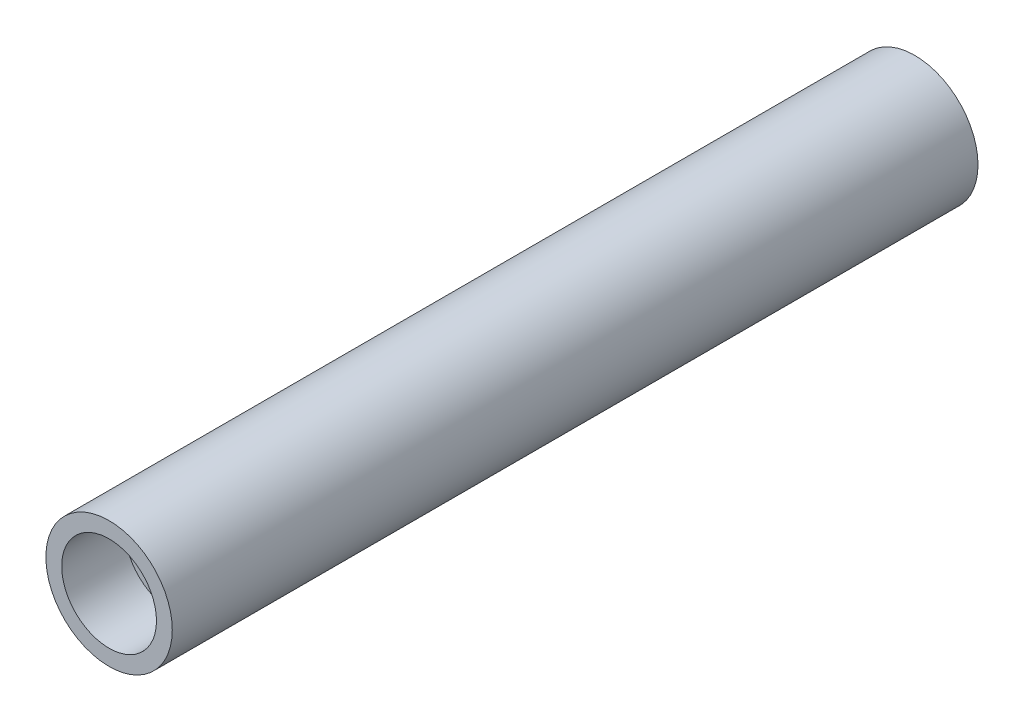
ISO-10303-21;
HEADER;
FILE_DESCRIPTION(('STEP AP214'),'2;1');
FILE_NAME('part.step','',(''),(''),'','','');
FILE_SCHEMA(('AUTOMOTIVE_DESIGN { 1 0 10303 214 1 1 1 1 }'));
ENDSEC;
DATA;
#1=APPLICATION_CONTEXT('core data for automotive mechanical design processes');
#2=APPLICATION_PROTOCOL_DEFINITION('international standard','automotive_design',2000,#1);
#3=PRODUCT_CONTEXT('',#1,'mechanical');
#4=PRODUCT('Part','Part','',(#3));
#5=PRODUCT_RELATED_PRODUCT_CATEGORY('part','',(#4));
#6=PRODUCT_DEFINITION_FORMATION('','',#4);
#7=PRODUCT_DEFINITION_CONTEXT('part definition',#1,'design');
#8=PRODUCT_DEFINITION('design','',#6,#7);
#9=PRODUCT_DEFINITION_SHAPE('','',#8);
#10=(LENGTH_UNIT() NAMED_UNIT(*) SI_UNIT(.MILLI.,.METRE.));
#11=(NAMED_UNIT(*) PLANE_ANGLE_UNIT() SI_UNIT($,.RADIAN.));
#12=(NAMED_UNIT(*) SI_UNIT($,.STERADIAN.) SOLID_ANGLE_UNIT());
#13=UNCERTAINTY_MEASURE_WITH_UNIT(LENGTH_MEASURE(1.E-05),#10,'distance_accuracy_value','');
#14=(GEOMETRIC_REPRESENTATION_CONTEXT(3) GLOBAL_UNCERTAINTY_ASSIGNED_CONTEXT((#13)) GLOBAL_UNIT_ASSIGNED_CONTEXT((#10,
#11,#12)) REPRESENTATION_CONTEXT('',''));
#15=CARTESIAN_POINT('',(0.,0.,0.));
#16=DIRECTION('',(0.,0.,1.));
#17=DIRECTION('',(1.,0.,0.));
#18=AXIS2_PLACEMENT_3D('',#15,#16,#17);
#19=CARTESIAN_POINT('',(0.,0.,102.));
#20=DIRECTION('',(0.,0.,-1.));
#21=DIRECTION('',(-1.,0.,0.));
#22=AXIS2_PLACEMENT_3D('',#19,#20,#21);
#23=CYLINDRICAL_SURFACE('',#22,3.3);
#24=CARTESIAN_POINT('',(0.,0.,0.));
#25=DIRECTION('',(0.,0.,1.));
#26=DIRECTION('',(1.,0.,0.));
#27=AXIS2_PLACEMENT_3D('',#24,#25,#26);
#28=CIRCLE('',#27,3.3);
#29=CARTESIAN_POINT('',(3.3,0.,0.));
#30=VERTEX_POINT('',#29);
#31=EDGE_CURVE('E49',#30,#30,#28,.T.);
#32=ORIENTED_EDGE('',*,*,#31,.F.);
#33=EDGE_LOOP('',(#32));
#34=FACE_BOUND('',#33,.T.);
#35=CARTESIAN_POINT('',(0.,0.,94.));
#36=DIRECTION('',(0.,0.,1.));
#37=DIRECTION('',(1.,0.,0.));
#38=AXIS2_PLACEMENT_3D('',#35,#36,#37);
#39=CIRCLE('',#38,3.3);
#40=CARTESIAN_POINT('',(3.3,0.,94.));
#41=VERTEX_POINT('',#40);
#42=EDGE_CURVE('E41',#41,#41,#39,.T.);
#43=ORIENTED_EDGE('',*,*,#42,.T.);
#44=EDGE_LOOP('',(#43));
#45=FACE_BOUND('',#44,.T.);
#46=ADVANCED_FACE('F40',(#34,#45),#23,.F.);
#47=CARTESIAN_POINT('',(0.,0.,102.));
#48=DIRECTION('',(0.,0.,1.));
#49=DIRECTION('',(1.,0.,0.));
#50=AXIS2_PLACEMENT_3D('',#47,#48,#49);
#51=PLANE('',#50);
#52=CARTESIAN_POINT('',(0.,0.,102.));
#53=DIRECTION('',(0.,0.,1.));
#54=DIRECTION('',(1.,0.,0.));
#55=AXIS2_PLACEMENT_3D('',#52,#53,#54);
#56=CIRCLE('',#55,6.);
#57=CARTESIAN_POINT('',(6.,0.,102.));
#58=VERTEX_POINT('',#57);
#59=EDGE_CURVE('E53',#58,#58,#56,.T.);
#60=ORIENTED_EDGE('',*,*,#59,.F.);
#61=EDGE_LOOP('',(#60));
#62=FACE_BOUND('',#61,.T.);
#63=CARTESIAN_POINT('',(0.,0.,102.));
#64=DIRECTION('',(0.,0.,1.));
#65=DIRECTION('',(1.,0.,0.));
#66=AXIS2_PLACEMENT_3D('',#63,#64,#65);
#67=CIRCLE('',#66,8.);
#68=CARTESIAN_POINT('',(8.,0.,102.));
#69=VERTEX_POINT('',#68);
#70=EDGE_CURVE('E10',#69,#69,#67,.T.);
#71=ORIENTED_EDGE('',*,*,#70,.T.);
#72=EDGE_LOOP('',(#71));
#73=FACE_BOUND('',#72,.T.);
#74=ADVANCED_FACE('F74',(#62,#73),#51,.T.);
#75=CARTESIAN_POINT('',(0.,0.,0.));
#76=DIRECTION('',(0.,0.,1.));
#77=DIRECTION('',(1.,0.,0.));
#78=AXIS2_PLACEMENT_3D('',#75,#76,#77);
#79=PLANE('',#78);
#80=CARTESIAN_POINT('',(0.,0.,0.));
#81=DIRECTION('',(0.,0.,1.));
#82=DIRECTION('',(1.,0.,0.));
#83=AXIS2_PLACEMENT_3D('',#80,#81,#82);
#84=CIRCLE('',#83,8.);
#85=CARTESIAN_POINT('',(8.,0.,0.));
#86=VERTEX_POINT('',#85);
#87=EDGE_CURVE('E44',#86,#86,#84,.T.);
#88=ORIENTED_EDGE('',*,*,#87,.F.);
#89=EDGE_LOOP('',(#88));
#90=FACE_BOUND('',#89,.T.);
#91=ORIENTED_EDGE('',*,*,#31,.T.);
#92=EDGE_LOOP('',(#91));
#93=FACE_BOUND('',#92,.T.);
#94=ADVANCED_FACE('F85',(#90,#93),#79,.F.);
#95=CARTESIAN_POINT('',(0.,0.,102.));
#96=DIRECTION('',(0.,0.,-1.));
#97=DIRECTION('',(-1.,0.,0.));
#98=AXIS2_PLACEMENT_3D('',#95,#96,#97);
#99=CYLINDRICAL_SURFACE('',#98,8.);
#100=ORIENTED_EDGE('',*,*,#70,.F.);
#101=EDGE_LOOP('',(#100));
#102=FACE_BOUND('',#101,.T.);
#103=ORIENTED_EDGE('',*,*,#87,.T.);
#104=EDGE_LOOP('',(#103));
#105=FACE_BOUND('',#104,.T.);
#106=ADVANCED_FACE('F39',(#102,#105),#99,.T.);
#107=CARTESIAN_POINT('',(0.,0.,94.));
#108=DIRECTION('',(0.,0.,1.));
#109=DIRECTION('',(1.,0.,0.));
#110=AXIS2_PLACEMENT_3D('',#107,#108,#109);
#111=CYLINDRICAL_SURFACE('',#110,6.);
#112=CARTESIAN_POINT('',(0.,0.,94.));
#113=DIRECTION('',(0.,0.,1.));
#114=DIRECTION('',(1.,0.,0.));
#115=AXIS2_PLACEMENT_3D('',#112,#113,#114);
#116=CIRCLE('',#115,6.);
#117=CARTESIAN_POINT('',(6.,0.,94.));
#118=VERTEX_POINT('',#117);
#119=EDGE_CURVE('E60',#118,#118,#116,.T.);
#120=ORIENTED_EDGE('',*,*,#119,.F.);
#121=EDGE_LOOP('',(#120));
#122=FACE_BOUND('',#121,.T.);
#123=ORIENTED_EDGE('',*,*,#59,.T.);
#124=EDGE_LOOP('',(#123));
#125=FACE_BOUND('',#124,.T.);
#126=ADVANCED_FACE('F70',(#122,#125),#111,.F.);
#127=CARTESIAN_POINT('',(0.,0.,94.));
#128=DIRECTION('',(0.,0.,1.));
#129=DIRECTION('',(1.,0.,0.));
#130=AXIS2_PLACEMENT_3D('',#127,#128,#129);
#131=PLANE('',#130);
#132=ORIENTED_EDGE('',*,*,#42,.F.);
#133=EDGE_LOOP('',(#132));
#134=FACE_BOUND('',#133,.T.);
#135=ORIENTED_EDGE('',*,*,#119,.T.);
#136=EDGE_LOOP('',(#135));
#137=FACE_BOUND('',#136,.T.);
#138=ADVANCED_FACE('F64',(#134,#137),#131,.T.);
#139=CLOSED_SHELL('',(#46,#74,#94,#106,#126,#138));
#140=MANIFOLD_SOLID_BREP('B2',#139);
#141=ADVANCED_BREP_SHAPE_REPRESENTATION('',(#18,#140),#14);
#142=SHAPE_DEFINITION_REPRESENTATION(#9,#141);
ENDSEC;
END-ISO-10303-21;
